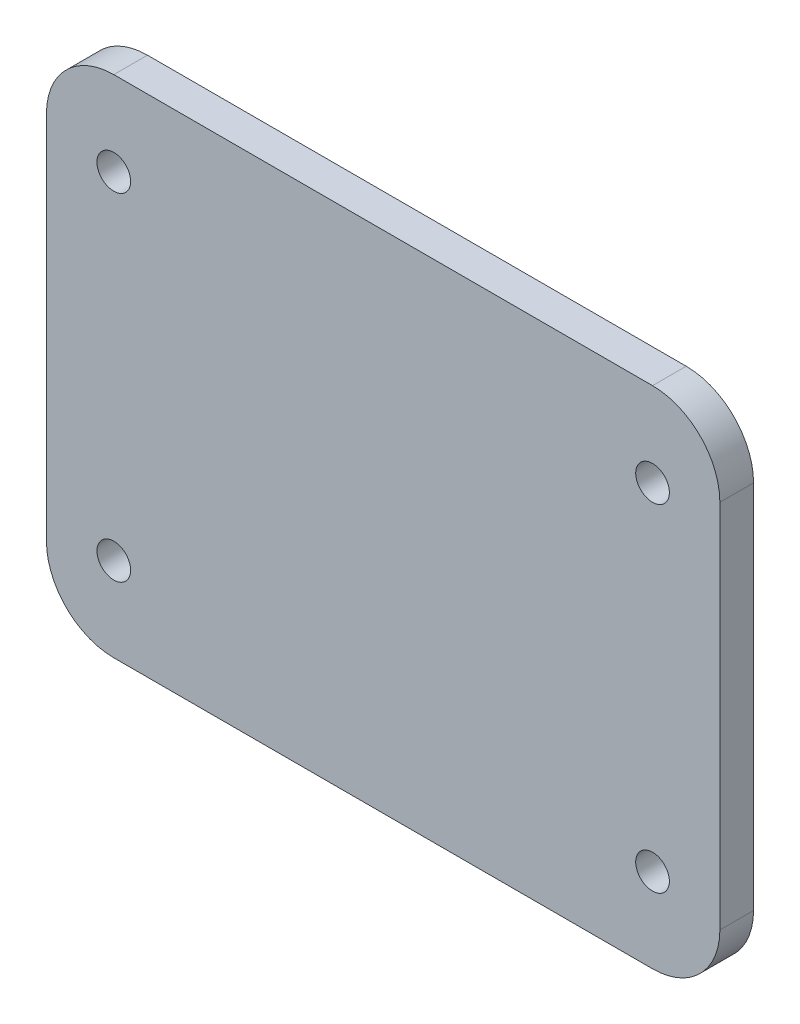
ISO-10303-21;
HEADER;
FILE_DESCRIPTION(('STEP AP214'),'2;1');
FILE_NAME('part.step','',(''),(''),'','','');
FILE_SCHEMA(('AUTOMOTIVE_DESIGN { 1 0 10303 214 1 1 1 1 }'));
ENDSEC;
DATA;
#1=APPLICATION_CONTEXT('core data for automotive mechanical design processes');
#2=APPLICATION_PROTOCOL_DEFINITION('international standard','automotive_design',2000,#1);
#3=PRODUCT_CONTEXT('',#1,'mechanical');
#4=PRODUCT('Part','Part','',(#3));
#5=PRODUCT_RELATED_PRODUCT_CATEGORY('part','',(#4));
#6=PRODUCT_DEFINITION_FORMATION('','',#4);
#7=PRODUCT_DEFINITION_CONTEXT('part definition',#1,'design');
#8=PRODUCT_DEFINITION('design','',#6,#7);
#9=PRODUCT_DEFINITION_SHAPE('','',#8);
#10=(LENGTH_UNIT() NAMED_UNIT(*) SI_UNIT(.MILLI.,.METRE.));
#11=(NAMED_UNIT(*) PLANE_ANGLE_UNIT() SI_UNIT($,.RADIAN.));
#12=(NAMED_UNIT(*) SI_UNIT($,.STERADIAN.) SOLID_ANGLE_UNIT());
#13=UNCERTAINTY_MEASURE_WITH_UNIT(LENGTH_MEASURE(1.E-05),#10,'distance_accuracy_value','');
#14=(GEOMETRIC_REPRESENTATION_CONTEXT(3) GLOBAL_UNCERTAINTY_ASSIGNED_CONTEXT((#13)) GLOBAL_UNIT_ASSIGNED_CONTEXT((#10,
#11,#12)) REPRESENTATION_CONTEXT('',''));
#15=CARTESIAN_POINT('',(0.,0.,0.));
#16=DIRECTION('',(0.,0.,1.));
#17=DIRECTION('',(1.,0.,0.));
#18=AXIS2_PLACEMENT_3D('',#15,#16,#17);
#19=CARTESIAN_POINT('',(40.,27.5,2.5));
#20=DIRECTION('',(0.,0.,-1.));
#21=DIRECTION('',(-1.,0.,0.));
#22=AXIS2_PLACEMENT_3D('',#19,#20,#21);
#23=PLANE('',#22);
#24=CARTESIAN_POINT('',(-40.,25.,2.5));
#25=DIRECTION('',(0.,0.,1.));
#26=DIRECTION('',(1.,0.,0.));
#27=AXIS2_PLACEMENT_3D('',#24,#25,#26);
#28=CIRCLE('',#27,2.5);
#29=CARTESIAN_POINT('',(-37.5,25.,2.5));
#30=VERTEX_POINT('',#29);
#31=EDGE_CURVE('E196',#30,#30,#28,.T.);
#32=ORIENTED_EDGE('',*,*,#31,.F.);
#33=EDGE_LOOP('',(#32));
#34=FACE_BOUND('',#33,.T.);
#35=CARTESIAN_POINT('',(-40.,-25.,2.5));
#36=DIRECTION('',(0.,0.,1.));
#37=DIRECTION('',(1.,0.,0.));
#38=AXIS2_PLACEMENT_3D('',#35,#36,#37);
#39=CIRCLE('',#38,2.5);
#40=CARTESIAN_POINT('',(-37.5,-25.,2.5));
#41=VERTEX_POINT('',#40);
#42=EDGE_CURVE('E190',#41,#41,#39,.T.);
#43=ORIENTED_EDGE('',*,*,#42,.F.);
#44=EDGE_LOOP('',(#43));
#45=FACE_BOUND('',#44,.T.);
#46=CARTESIAN_POINT('',(40.,-25.,2.5));
#47=DIRECTION('',(0.,0.,1.));
#48=DIRECTION('',(1.,0.,0.));
#49=AXIS2_PLACEMENT_3D('',#46,#47,#48);
#50=CIRCLE('',#49,2.5);
#51=CARTESIAN_POINT('',(42.5,-25.,2.5));
#52=VERTEX_POINT('',#51);
#53=EDGE_CURVE('E184',#52,#52,#50,.T.);
#54=ORIENTED_EDGE('',*,*,#53,.F.);
#55=EDGE_LOOP('',(#54));
#56=FACE_BOUND('',#55,.T.);
#57=CARTESIAN_POINT('',(40.,25.,2.5));
#58=DIRECTION('',(0.,0.,1.));
#59=DIRECTION('',(1.,0.,0.));
#60=AXIS2_PLACEMENT_3D('',#57,#58,#59);
#61=CIRCLE('',#60,2.5);
#62=CARTESIAN_POINT('',(42.5,25.,2.5));
#63=VERTEX_POINT('',#62);
#64=EDGE_CURVE('E178',#63,#63,#61,.T.);
#65=ORIENTED_EDGE('',*,*,#64,.F.);
#66=EDGE_LOOP('',(#65));
#67=FACE_BOUND('',#66,.T.);
#68=CARTESIAN_POINT('',(40.,27.5,2.5));
#69=DIRECTION('',(0.,0.,1.));
#70=DIRECTION('',(-1.,0.,0.));
#71=AXIS2_PLACEMENT_3D('',#68,#69,#70);
#72=CIRCLE('',#71,10.);
#73=CARTESIAN_POINT('',(50.,27.4999999999999,2.5));
#74=VERTEX_POINT('',#73);
#75=CARTESIAN_POINT('',(39.9999999999999,37.5,2.5));
#76=VERTEX_POINT('',#75);
#77=EDGE_CURVE('E145',#74,#76,#72,.T.);
#78=ORIENTED_EDGE('',*,*,#77,.T.);
#79=DIRECTION('',(-1.,0.,0.));
#80=VECTOR('',#79,1.);
#81=CARTESIAN_POINT('',(-39.9999999999999,37.5,2.5));
#82=LINE('',#81,#80);
#83=CARTESIAN_POINT('',(-39.9999999999999,37.5,2.5));
#84=VERTEX_POINT('',#83);
#85=EDGE_CURVE('E94',#76,#84,#82,.T.);
#86=ORIENTED_EDGE('',*,*,#85,.T.);
#87=CARTESIAN_POINT('',(-40.,27.5,2.5));
#88=DIRECTION('',(0.,0.,1.));
#89=DIRECTION('',(1.,0.,0.));
#90=AXIS2_PLACEMENT_3D('',#87,#88,#89);
#91=CIRCLE('',#90,10.);
#92=CARTESIAN_POINT('',(-50.,27.4999999999999,2.5));
#93=VERTEX_POINT('',#92);
#94=EDGE_CURVE('E160',#84,#93,#91,.T.);
#95=ORIENTED_EDGE('',*,*,#94,.T.);
#96=DIRECTION('',(0.,-1.,0.));
#97=VECTOR('',#96,1.);
#98=CARTESIAN_POINT('',(-50.,-27.4999999999999,2.5));
#99=LINE('',#98,#97);
#100=CARTESIAN_POINT('',(-50.,-27.4999999999999,2.5));
#101=VERTEX_POINT('',#100);
#102=EDGE_CURVE('E172',#93,#101,#99,.T.);
#103=ORIENTED_EDGE('',*,*,#102,.T.);
#104=CARTESIAN_POINT('',(-40.,-27.5,2.5));
#105=DIRECTION('',(0.,0.,1.));
#106=DIRECTION('',(-1.,0.,0.));
#107=AXIS2_PLACEMENT_3D('',#104,#105,#106);
#108=CIRCLE('',#107,10.);
#109=CARTESIAN_POINT('',(-39.9999999999999,-37.5,2.5));
#110=VERTEX_POINT('',#109);
#111=EDGE_CURVE('E112',#101,#110,#108,.T.);
#112=ORIENTED_EDGE('',*,*,#111,.T.);
#113=DIRECTION('',(1.,0.,0.));
#114=VECTOR('',#113,1.);
#115=CARTESIAN_POINT('',(-39.9999999999999,-37.5,2.5));
#116=LINE('',#115,#114);
#117=CARTESIAN_POINT('',(39.9999999999999,-37.5,2.5));
#118=VERTEX_POINT('',#117);
#119=EDGE_CURVE('E107',#110,#118,#116,.T.);
#120=ORIENTED_EDGE('',*,*,#119,.T.);
#121=CARTESIAN_POINT('',(40.,-27.5,2.5));
#122=DIRECTION('',(0.,0.,1.));
#123=DIRECTION('',(-1.,0.,0.));
#124=AXIS2_PLACEMENT_3D('',#121,#122,#123);
#125=CIRCLE('',#124,10.);
#126=CARTESIAN_POINT('',(50.,-27.4999999999999,2.5));
#127=VERTEX_POINT('',#126);
#128=EDGE_CURVE('E110',#118,#127,#125,.T.);
#129=ORIENTED_EDGE('',*,*,#128,.T.);
#130=DIRECTION('',(0.,1.,0.));
#131=VECTOR('',#130,1.);
#132=CARTESIAN_POINT('',(50.,-27.4999999999999,2.5));
#133=LINE('',#132,#131);
#134=EDGE_CURVE('E51',#127,#74,#133,.T.);
#135=ORIENTED_EDGE('',*,*,#134,.T.);
#136=EDGE_LOOP('',(#78,#86,#95,#103,#112,#120,#129,#135));
#137=FACE_BOUND('',#136,.T.);
#138=ADVANCED_FACE('F34',(#34,#45,#56,#67,#137),#23,.F.);
#139=CARTESIAN_POINT('',(40.,27.5,-2.5));
#140=DIRECTION('',(0.,0.,-1.));
#141=DIRECTION('',(-1.,0.,0.));
#142=AXIS2_PLACEMENT_3D('',#139,#140,#141);
#143=PLANE('',#142);
#144=CARTESIAN_POINT('',(-40.,25.,-2.5));
#145=DIRECTION('',(0.,0.,1.));
#146=DIRECTION('',(1.,0.,0.));
#147=AXIS2_PLACEMENT_3D('',#144,#145,#146);
#148=CIRCLE('',#147,2.5);
#149=CARTESIAN_POINT('',(-37.5,25.,-2.5));
#150=VERTEX_POINT('',#149);
#151=EDGE_CURVE('E181',#150,#150,#148,.T.);
#152=ORIENTED_EDGE('',*,*,#151,.T.);
#153=EDGE_LOOP('',(#152));
#154=FACE_BOUND('',#153,.T.);
#155=CARTESIAN_POINT('',(-40.,-25.,-2.5));
#156=DIRECTION('',(0.,0.,1.));
#157=DIRECTION('',(1.,0.,0.));
#158=AXIS2_PLACEMENT_3D('',#155,#156,#157);
#159=CIRCLE('',#158,2.5);
#160=CARTESIAN_POINT('',(-37.5,-25.,-2.5));
#161=VERTEX_POINT('',#160);
#162=EDGE_CURVE('E193',#161,#161,#159,.T.);
#163=ORIENTED_EDGE('',*,*,#162,.T.);
#164=EDGE_LOOP('',(#163));
#165=FACE_BOUND('',#164,.T.);
#166=CARTESIAN_POINT('',(40.,-25.,-2.5));
#167=DIRECTION('',(0.,0.,1.));
#168=DIRECTION('',(1.,0.,0.));
#169=AXIS2_PLACEMENT_3D('',#166,#167,#168);
#170=CIRCLE('',#169,2.5);
#171=CARTESIAN_POINT('',(42.5,-25.,-2.5));
#172=VERTEX_POINT('',#171);
#173=EDGE_CURVE('E187',#172,#172,#170,.T.);
#174=ORIENTED_EDGE('',*,*,#173,.T.);
#175=EDGE_LOOP('',(#174));
#176=FACE_BOUND('',#175,.T.);
#177=CARTESIAN_POINT('',(40.,25.,-2.5));
#178=DIRECTION('',(0.,0.,1.));
#179=DIRECTION('',(1.,0.,0.));
#180=AXIS2_PLACEMENT_3D('',#177,#178,#179);
#181=CIRCLE('',#180,2.5);
#182=CARTESIAN_POINT('',(42.5,25.,-2.5));
#183=VERTEX_POINT('',#182);
#184=EDGE_CURVE('E134',#183,#183,#181,.T.);
#185=ORIENTED_EDGE('',*,*,#184,.T.);
#186=EDGE_LOOP('',(#185));
#187=FACE_BOUND('',#186,.T.);
#188=CARTESIAN_POINT('',(40.,27.5,-2.5));
#189=DIRECTION('',(0.,0.,1.));
#190=DIRECTION('',(-1.,0.,0.));
#191=AXIS2_PLACEMENT_3D('',#188,#189,#190);
#192=CIRCLE('',#191,10.);
#193=CARTESIAN_POINT('',(50.,27.4999999999999,-2.5));
#194=VERTEX_POINT('',#193);
#195=CARTESIAN_POINT('',(39.9999999999999,37.5,-2.5));
#196=VERTEX_POINT('',#195);
#197=EDGE_CURVE('E130',#194,#196,#192,.T.);
#198=ORIENTED_EDGE('',*,*,#197,.F.);
#199=DIRECTION('',(0.,1.,0.));
#200=VECTOR('',#199,1.);
#201=CARTESIAN_POINT('',(50.,-27.4999999999999,-2.5));
#202=LINE('',#201,#200);
#203=CARTESIAN_POINT('',(50.,-27.4999999999999,-2.5));
#204=VERTEX_POINT('',#203);
#205=EDGE_CURVE('E86',#204,#194,#202,.T.);
#206=ORIENTED_EDGE('',*,*,#205,.F.);
#207=CARTESIAN_POINT('',(40.,-27.5,-2.5));
#208=DIRECTION('',(0.,0.,1.));
#209=DIRECTION('',(-1.,0.,0.));
#210=AXIS2_PLACEMENT_3D('',#207,#208,#209);
#211=CIRCLE('',#210,10.);
#212=CARTESIAN_POINT('',(39.9999999999999,-37.5,-2.5));
#213=VERTEX_POINT('',#212);
#214=EDGE_CURVE('E80',#213,#204,#211,.T.);
#215=ORIENTED_EDGE('',*,*,#214,.F.);
#216=DIRECTION('',(1.,0.,0.));
#217=VECTOR('',#216,1.);
#218=CARTESIAN_POINT('',(-39.9999999999999,-37.5,-2.5));
#219=LINE('',#218,#217);
#220=CARTESIAN_POINT('',(-39.9999999999999,-37.5,-2.5));
#221=VERTEX_POINT('',#220);
#222=EDGE_CURVE('E120',#221,#213,#219,.T.);
#223=ORIENTED_EDGE('',*,*,#222,.F.);
#224=CARTESIAN_POINT('',(-40.,-27.5,-2.5));
#225=DIRECTION('',(0.,0.,1.));
#226=DIRECTION('',(-1.,0.,0.));
#227=AXIS2_PLACEMENT_3D('',#224,#225,#226);
#228=CIRCLE('',#227,10.);
#229=CARTESIAN_POINT('',(-50.,-27.4999999999999,-2.5));
#230=VERTEX_POINT('',#229);
#231=EDGE_CURVE('E140',#230,#221,#228,.T.);
#232=ORIENTED_EDGE('',*,*,#231,.F.);
#233=DIRECTION('',(0.,-1.,0.));
#234=VECTOR('',#233,1.);
#235=CARTESIAN_POINT('',(-50.,-27.4999999999999,-2.5));
#236=LINE('',#235,#234);
#237=CARTESIAN_POINT('',(-50.,27.4999999999999,-2.5));
#238=VERTEX_POINT('',#237);
#239=EDGE_CURVE('E138',#238,#230,#236,.T.);
#240=ORIENTED_EDGE('',*,*,#239,.F.);
#241=CARTESIAN_POINT('',(-40.,27.5,-2.5));
#242=DIRECTION('',(0.,0.,1.));
#243=DIRECTION('',(1.,0.,0.));
#244=AXIS2_PLACEMENT_3D('',#241,#242,#243);
#245=CIRCLE('',#244,10.);
#246=CARTESIAN_POINT('',(-39.9999999999999,37.5,-2.5));
#247=VERTEX_POINT('',#246);
#248=EDGE_CURVE('E136',#247,#238,#245,.T.);
#249=ORIENTED_EDGE('',*,*,#248,.F.);
#250=DIRECTION('',(-1.,0.,0.));
#251=VECTOR('',#250,1.);
#252=CARTESIAN_POINT('',(-39.9999999999999,37.5,-2.5));
#253=LINE('',#252,#251);
#254=EDGE_CURVE('E133',#196,#247,#253,.T.);
#255=ORIENTED_EDGE('',*,*,#254,.F.);
#256=EDGE_LOOP('',(#198,#206,#215,#223,#232,#240,#249,#255));
#257=FACE_BOUND('',#256,.T.);
#258=ADVANCED_FACE('F164',(#154,#165,#176,#187,#257),#143,.T.);
#259=CARTESIAN_POINT('',(40.,27.5,2.5));
#260=DIRECTION('',(0.,0.,-1.));
#261=DIRECTION('',(-1.,0.,0.));
#262=AXIS2_PLACEMENT_3D('',#259,#260,#261);
#263=CYLINDRICAL_SURFACE('',#262,10.);
#264=ORIENTED_EDGE('',*,*,#197,.T.);
#265=DIRECTION('',(0.,0.,-1.));
#266=VECTOR('',#265,1.);
#267=CARTESIAN_POINT('',(39.9999999999999,37.5,2.5));
#268=LINE('',#267,#266);
#269=EDGE_CURVE('E11',#76,#196,#268,.T.);
#270=ORIENTED_EDGE('',*,*,#269,.F.);
#271=ORIENTED_EDGE('',*,*,#77,.F.);
#272=DIRECTION('',(0.,0.,-1.));
#273=VECTOR('',#272,1.);
#274=CARTESIAN_POINT('',(50.,27.4999999999999,2.5));
#275=LINE('',#274,#273);
#276=EDGE_CURVE('E126',#74,#194,#275,.T.);
#277=ORIENTED_EDGE('',*,*,#276,.T.);
#278=EDGE_LOOP('',(#264,#270,#271,#277));
#279=FACE_BOUND('',#278,.T.);
#280=ADVANCED_FACE('F36',(#279),#263,.T.);
#281=CARTESIAN_POINT('',(-39.9999999999999,37.5,2.5));
#282=DIRECTION('',(0.,-1.,0.));
#283=DIRECTION('',(0.,0.,-1.));
#284=AXIS2_PLACEMENT_3D('',#281,#282,#283);
#285=PLANE('',#284);
#286=ORIENTED_EDGE('',*,*,#254,.T.);
#287=DIRECTION('',(0.,0.,-1.));
#288=VECTOR('',#287,1.);
#289=CARTESIAN_POINT('',(-39.9999999999999,37.5,2.5));
#290=LINE('',#289,#288);
#291=EDGE_CURVE('E43',#84,#247,#290,.T.);
#292=ORIENTED_EDGE('',*,*,#291,.F.);
#293=ORIENTED_EDGE('',*,*,#85,.F.);
#294=ORIENTED_EDGE('',*,*,#269,.T.);
#295=EDGE_LOOP('',(#286,#292,#293,#294));
#296=FACE_BOUND('',#295,.T.);
#297=ADVANCED_FACE('F247',(#296),#285,.F.);
#298=CARTESIAN_POINT('',(-40.,27.5,2.5));
#299=DIRECTION('',(0.,0.,-1.));
#300=DIRECTION('',(-1.,0.,0.));
#301=AXIS2_PLACEMENT_3D('',#298,#299,#300);
#302=CYLINDRICAL_SURFACE('',#301,10.);
#303=ORIENTED_EDGE('',*,*,#248,.T.);
#304=DIRECTION('',(0.,0.,-1.));
#305=VECTOR('',#304,1.);
#306=CARTESIAN_POINT('',(-50.,27.4999999999999,2.5));
#307=LINE('',#306,#305);
#308=EDGE_CURVE('E152',#93,#238,#307,.T.);
#309=ORIENTED_EDGE('',*,*,#308,.F.);
#310=ORIENTED_EDGE('',*,*,#94,.F.);
#311=ORIENTED_EDGE('',*,*,#291,.T.);
#312=EDGE_LOOP('',(#303,#309,#310,#311));
#313=FACE_BOUND('',#312,.T.);
#314=ADVANCED_FACE('F158',(#313),#302,.T.);
#315=CARTESIAN_POINT('',(-50.,-27.4999999999999,2.5));
#316=DIRECTION('',(1.,0.,0.));
#317=DIRECTION('',(0.,0.,-1.));
#318=AXIS2_PLACEMENT_3D('',#315,#316,#317);
#319=PLANE('',#318);
#320=ORIENTED_EDGE('',*,*,#239,.T.);
#321=DIRECTION('',(0.,0.,-1.));
#322=VECTOR('',#321,1.);
#323=CARTESIAN_POINT('',(-50.,-27.4999999999999,2.5));
#324=LINE('',#323,#322);
#325=EDGE_CURVE('E149',#101,#230,#324,.T.);
#326=ORIENTED_EDGE('',*,*,#325,.F.);
#327=ORIENTED_EDGE('',*,*,#102,.F.);
#328=ORIENTED_EDGE('',*,*,#308,.T.);
#329=EDGE_LOOP('',(#320,#326,#327,#328));
#330=FACE_BOUND('',#329,.T.);
#331=ADVANCED_FACE('F168',(#330),#319,.F.);
#332=CARTESIAN_POINT('',(-40.,-27.5,2.5));
#333=DIRECTION('',(0.,0.,-1.));
#334=DIRECTION('',(-1.,0.,0.));
#335=AXIS2_PLACEMENT_3D('',#332,#333,#334);
#336=CYLINDRICAL_SURFACE('',#335,10.);
#337=ORIENTED_EDGE('',*,*,#231,.T.);
#338=DIRECTION('',(0.,0.,-1.));
#339=VECTOR('',#338,1.);
#340=CARTESIAN_POINT('',(-39.9999999999999,-37.5,2.5));
#341=LINE('',#340,#339);
#342=EDGE_CURVE('E121',#110,#221,#341,.T.);
#343=ORIENTED_EDGE('',*,*,#342,.F.);
#344=ORIENTED_EDGE('',*,*,#111,.F.);
#345=ORIENTED_EDGE('',*,*,#325,.T.);
#346=EDGE_LOOP('',(#337,#343,#344,#345));
#347=FACE_BOUND('',#346,.T.);
#348=ADVANCED_FACE('F171',(#347),#336,.T.);
#349=CARTESIAN_POINT('',(-39.9999999999999,-37.5,2.5));
#350=DIRECTION('',(0.,1.,0.));
#351=DIRECTION('',(0.,0.,1.));
#352=AXIS2_PLACEMENT_3D('',#349,#350,#351);
#353=PLANE('',#352);
#354=ORIENTED_EDGE('',*,*,#222,.T.);
#355=DIRECTION('',(0.,0.,-1.));
#356=VECTOR('',#355,1.);
#357=CARTESIAN_POINT('',(39.9999999999999,-37.5,2.5));
#358=LINE('',#357,#356);
#359=EDGE_CURVE('E117',#118,#213,#358,.T.);
#360=ORIENTED_EDGE('',*,*,#359,.F.);
#361=ORIENTED_EDGE('',*,*,#119,.F.);
#362=ORIENTED_EDGE('',*,*,#342,.T.);
#363=EDGE_LOOP('',(#354,#360,#361,#362));
#364=FACE_BOUND('',#363,.T.);
#365=ADVANCED_FACE('F118',(#364),#353,.F.);
#366=CARTESIAN_POINT('',(40.,-27.5,2.5));
#367=DIRECTION('',(0.,0.,-1.));
#368=DIRECTION('',(-1.,0.,0.));
#369=AXIS2_PLACEMENT_3D('',#366,#367,#368);
#370=CYLINDRICAL_SURFACE('',#369,10.);
#371=ORIENTED_EDGE('',*,*,#214,.T.);
#372=DIRECTION('',(0.,0.,-1.));
#373=VECTOR('',#372,1.);
#374=CARTESIAN_POINT('',(50.,-27.4999999999999,2.5));
#375=LINE('',#374,#373);
#376=EDGE_CURVE('E122',#127,#204,#375,.T.);
#377=ORIENTED_EDGE('',*,*,#376,.F.);
#378=ORIENTED_EDGE('',*,*,#128,.F.);
#379=ORIENTED_EDGE('',*,*,#359,.T.);
#380=EDGE_LOOP('',(#371,#377,#378,#379));
#381=FACE_BOUND('',#380,.T.);
#382=ADVANCED_FACE('F124',(#381),#370,.T.);
#383=CARTESIAN_POINT('',(50.,-27.4999999999999,2.5));
#384=DIRECTION('',(-1.,0.,0.));
#385=DIRECTION('',(0.,0.,1.));
#386=AXIS2_PLACEMENT_3D('',#383,#384,#385);
#387=PLANE('',#386);
#388=ORIENTED_EDGE('',*,*,#205,.T.);
#389=ORIENTED_EDGE('',*,*,#276,.F.);
#390=ORIENTED_EDGE('',*,*,#134,.F.);
#391=ORIENTED_EDGE('',*,*,#376,.T.);
#392=EDGE_LOOP('',(#388,#389,#390,#391));
#393=FACE_BOUND('',#392,.T.);
#394=ADVANCED_FACE('F223',(#393),#387,.F.);
#395=CARTESIAN_POINT('',(40.,25.,-2.5));
#396=DIRECTION('',(0.,0.,1.));
#397=DIRECTION('',(1.,0.,0.));
#398=AXIS2_PLACEMENT_3D('',#395,#396,#397);
#399=CYLINDRICAL_SURFACE('',#398,2.5);
#400=ORIENTED_EDGE('',*,*,#184,.F.);
#401=EDGE_LOOP('',(#400));
#402=FACE_BOUND('',#401,.T.);
#403=ORIENTED_EDGE('',*,*,#64,.T.);
#404=EDGE_LOOP('',(#403));
#405=FACE_BOUND('',#404,.T.);
#406=ADVANCED_FACE('F220',(#402,#405),#399,.F.);
#407=CARTESIAN_POINT('',(40.,-25.,-2.5));
#408=DIRECTION('',(0.,0.,1.));
#409=DIRECTION('',(1.,0.,0.));
#410=AXIS2_PLACEMENT_3D('',#407,#408,#409);
#411=CYLINDRICAL_SURFACE('',#410,2.5);
#412=ORIENTED_EDGE('',*,*,#173,.F.);
#413=EDGE_LOOP('',(#412));
#414=FACE_BOUND('',#413,.T.);
#415=ORIENTED_EDGE('',*,*,#53,.T.);
#416=EDGE_LOOP('',(#415));
#417=FACE_BOUND('',#416,.T.);
#418=ADVANCED_FACE('F222',(#414,#417),#411,.F.);
#419=CARTESIAN_POINT('',(-40.,-25.,-2.5));
#420=DIRECTION('',(0.,0.,1.));
#421=DIRECTION('',(1.,0.,0.));
#422=AXIS2_PLACEMENT_3D('',#419,#420,#421);
#423=CYLINDRICAL_SURFACE('',#422,2.5);
#424=ORIENTED_EDGE('',*,*,#162,.F.);
#425=EDGE_LOOP('',(#424));
#426=FACE_BOUND('',#425,.T.);
#427=ORIENTED_EDGE('',*,*,#42,.T.);
#428=EDGE_LOOP('',(#427));
#429=FACE_BOUND('',#428,.T.);
#430=ADVANCED_FACE('F207',(#426,#429),#423,.F.);
#431=CARTESIAN_POINT('',(-40.,25.,-2.5));
#432=DIRECTION('',(0.,0.,1.));
#433=DIRECTION('',(1.,0.,0.));
#434=AXIS2_PLACEMENT_3D('',#431,#432,#433);
#435=CYLINDRICAL_SURFACE('',#434,2.5);
#436=ORIENTED_EDGE('',*,*,#151,.F.);
#437=EDGE_LOOP('',(#436));
#438=FACE_BOUND('',#437,.T.);
#439=ORIENTED_EDGE('',*,*,#31,.T.);
#440=EDGE_LOOP('',(#439));
#441=FACE_BOUND('',#440,.T.);
#442=ADVANCED_FACE('F204',(#438,#441),#435,.F.);
#443=CLOSED_SHELL('',(#138,#258,#280,#297,#314,#331,#348,#365,#382,#394,#406,#418,#430,#442));
#444=MANIFOLD_SOLID_BREP('B2',#443);
#445=ADVANCED_BREP_SHAPE_REPRESENTATION('',(#18,#444),#14);
#446=SHAPE_DEFINITION_REPRESENTATION(#9,#445);
ENDSEC;
END-ISO-10303-21;
